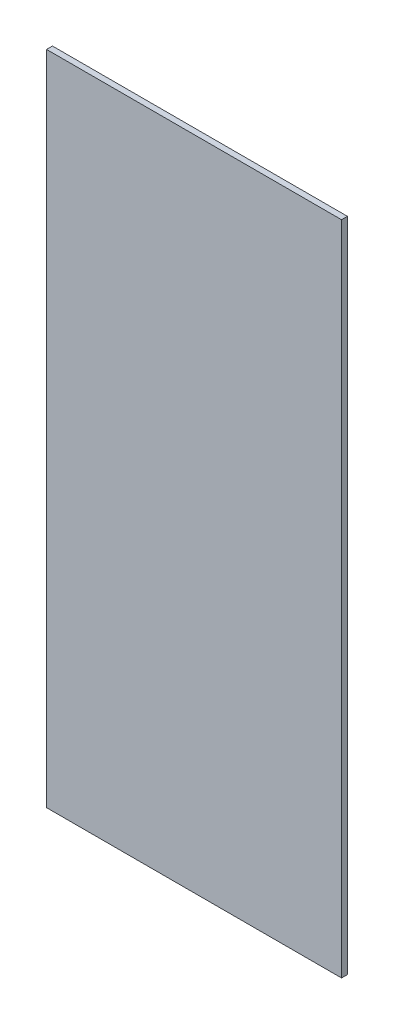
ISO-10303-21;
HEADER;
FILE_DESCRIPTION(('STEP AP214'),'2;1');
FILE_NAME('part.step','',(''),(''),'','','');
FILE_SCHEMA(('AUTOMOTIVE_DESIGN { 1 0 10303 214 1 1 1 1 }'));
ENDSEC;
DATA;
#1=APPLICATION_CONTEXT('core data for automotive mechanical design processes');
#2=APPLICATION_PROTOCOL_DEFINITION('international standard','automotive_design',2000,#1);
#3=PRODUCT_CONTEXT('',#1,'mechanical');
#4=PRODUCT('Part','Part','',(#3));
#5=PRODUCT_RELATED_PRODUCT_CATEGORY('part','',(#4));
#6=PRODUCT_DEFINITION_FORMATION('','',#4);
#7=PRODUCT_DEFINITION_CONTEXT('part definition',#1,'design');
#8=PRODUCT_DEFINITION('design','',#6,#7);
#9=PRODUCT_DEFINITION_SHAPE('','',#8);
#10=(LENGTH_UNIT() NAMED_UNIT(*) SI_UNIT(.MILLI.,.METRE.));
#11=(NAMED_UNIT(*) PLANE_ANGLE_UNIT() SI_UNIT($,.RADIAN.));
#12=(NAMED_UNIT(*) SI_UNIT($,.STERADIAN.) SOLID_ANGLE_UNIT());
#13=UNCERTAINTY_MEASURE_WITH_UNIT(LENGTH_MEASURE(1.E-05),#10,'distance_accuracy_value','');
#14=(GEOMETRIC_REPRESENTATION_CONTEXT(3) GLOBAL_UNCERTAINTY_ASSIGNED_CONTEXT((#13)) GLOBAL_UNIT_ASSIGNED_CONTEXT((#10,
#11,#12)) REPRESENTATION_CONTEXT('',''));
#15=CARTESIAN_POINT('',(0.,0.,0.));
#16=DIRECTION('',(0.,0.,1.));
#17=DIRECTION('',(1.,0.,0.));
#18=AXIS2_PLACEMENT_3D('',#15,#16,#17);
#19=CARTESIAN_POINT('',(0.,0.,20.));
#20=DIRECTION('',(1.,0.,0.));
#21=DIRECTION('',(0.,0.,-1.));
#22=AXIS2_PLACEMENT_3D('',#19,#20,#21);
#23=PLANE('',#22);
#24=DIRECTION('',(0.,-1.,0.));
#25=VECTOR('',#24,1.);
#26=CARTESIAN_POINT('',(0.,0.,0.));
#27=LINE('',#26,#25);
#28=CARTESIAN_POINT('',(0.,2226.,0.));
#29=VERTEX_POINT('',#28);
#30=CARTESIAN_POINT('',(0.,0.,0.));
#31=VERTEX_POINT('',#30);
#32=EDGE_CURVE('E107',#29,#31,#27,.T.);
#33=ORIENTED_EDGE('',*,*,#32,.T.);
#34=DIRECTION('',(0.,0.,-1.));
#35=VECTOR('',#34,1.);
#36=CARTESIAN_POINT('',(0.,0.,20.));
#37=LINE('',#36,#35);
#38=CARTESIAN_POINT('',(0.,0.,20.));
#39=VERTEX_POINT('',#38);
#40=EDGE_CURVE('E11',#39,#31,#37,.T.);
#41=ORIENTED_EDGE('',*,*,#40,.F.);
#42=DIRECTION('',(0.,-1.,0.));
#43=VECTOR('',#42,1.);
#44=CARTESIAN_POINT('',(0.,0.,20.));
#45=LINE('',#44,#43);
#46=CARTESIAN_POINT('',(0.,2226.,20.));
#47=VERTEX_POINT('',#46);
#48=EDGE_CURVE('E91',#47,#39,#45,.T.);
#49=ORIENTED_EDGE('',*,*,#48,.F.);
#50=DIRECTION('',(0.,0.,-1.));
#51=VECTOR('',#50,1.);
#52=CARTESIAN_POINT('',(0.,2226.,20.));
#53=LINE('',#52,#51);
#54=EDGE_CURVE('E103',#47,#29,#53,.T.);
#55=ORIENTED_EDGE('',*,*,#54,.T.);
#56=EDGE_LOOP('',(#33,#41,#49,#55));
#57=FACE_BOUND('',#56,.T.);
#58=ADVANCED_FACE('F39',(#57),#23,.F.);
#59=CARTESIAN_POINT('',(0.,0.,20.));
#60=DIRECTION('',(0.,1.,0.));
#61=DIRECTION('',(0.,0.,1.));
#62=AXIS2_PLACEMENT_3D('',#59,#60,#61);
#63=PLANE('',#62);
#64=DIRECTION('',(1.,0.,0.));
#65=VECTOR('',#64,1.);
#66=CARTESIAN_POINT('',(0.,0.,0.));
#67=LINE('',#66,#65);
#68=CARTESIAN_POINT('',(1000.,0.,0.));
#69=VERTEX_POINT('',#68);
#70=EDGE_CURVE('E96',#31,#69,#67,.T.);
#71=ORIENTED_EDGE('',*,*,#70,.T.);
#72=DIRECTION('',(0.,0.,-1.));
#73=VECTOR('',#72,1.);
#74=CARTESIAN_POINT('',(1000.,0.,20.));
#75=LINE('',#74,#73);
#76=CARTESIAN_POINT('',(1000.,0.,20.));
#77=VERTEX_POINT('',#76);
#78=EDGE_CURVE('E48',#77,#69,#75,.T.);
#79=ORIENTED_EDGE('',*,*,#78,.F.);
#80=DIRECTION('',(1.,0.,0.));
#81=VECTOR('',#80,1.);
#82=CARTESIAN_POINT('',(0.,0.,20.));
#83=LINE('',#82,#81);
#84=EDGE_CURVE('E86',#39,#77,#83,.T.);
#85=ORIENTED_EDGE('',*,*,#84,.F.);
#86=ORIENTED_EDGE('',*,*,#40,.T.);
#87=EDGE_LOOP('',(#71,#79,#85,#86));
#88=FACE_BOUND('',#87,.T.);
#89=ADVANCED_FACE('F95',(#88),#63,.F.);
#90=CARTESIAN_POINT('',(1000.,0.,20.));
#91=DIRECTION('',(-1.,0.,0.));
#92=DIRECTION('',(0.,0.,1.));
#93=AXIS2_PLACEMENT_3D('',#90,#91,#92);
#94=PLANE('',#93);
#95=DIRECTION('',(0.,1.,0.));
#96=VECTOR('',#95,1.);
#97=CARTESIAN_POINT('',(1000.,0.,0.));
#98=LINE('',#97,#96);
#99=CARTESIAN_POINT('',(1000.,2226.,0.));
#100=VERTEX_POINT('',#99);
#101=EDGE_CURVE('E73',#69,#100,#98,.T.);
#102=ORIENTED_EDGE('',*,*,#101,.T.);
#103=DIRECTION('',(0.,0.,-1.));
#104=VECTOR('',#103,1.);
#105=CARTESIAN_POINT('',(1000.,2226.,20.));
#106=LINE('',#105,#104);
#107=CARTESIAN_POINT('',(1000.,2226.,20.));
#108=VERTEX_POINT('',#107);
#109=EDGE_CURVE('E98',#108,#100,#106,.T.);
#110=ORIENTED_EDGE('',*,*,#109,.F.);
#111=DIRECTION('',(0.,1.,0.));
#112=VECTOR('',#111,1.);
#113=CARTESIAN_POINT('',(1000.,0.,20.));
#114=LINE('',#113,#112);
#115=EDGE_CURVE('E89',#77,#108,#114,.T.);
#116=ORIENTED_EDGE('',*,*,#115,.F.);
#117=ORIENTED_EDGE('',*,*,#78,.T.);
#118=EDGE_LOOP('',(#102,#110,#116,#117));
#119=FACE_BOUND('',#118,.T.);
#120=ADVANCED_FACE('F99',(#119),#94,.F.);
#121=CARTESIAN_POINT('',(0.,2226.,20.));
#122=DIRECTION('',(0.,-1.,0.));
#123=DIRECTION('',(0.,0.,-1.));
#124=AXIS2_PLACEMENT_3D('',#121,#122,#123);
#125=PLANE('',#124);
#126=DIRECTION('',(-1.,0.,0.));
#127=VECTOR('',#126,1.);
#128=CARTESIAN_POINT('',(0.,2226.,0.));
#129=LINE('',#128,#127);
#130=EDGE_CURVE('E79',#100,#29,#129,.T.);
#131=ORIENTED_EDGE('',*,*,#130,.T.);
#132=ORIENTED_EDGE('',*,*,#54,.F.);
#133=DIRECTION('',(-1.,0.,0.));
#134=VECTOR('',#133,1.);
#135=CARTESIAN_POINT('',(0.,2226.,20.));
#136=LINE('',#135,#134);
#137=EDGE_CURVE('E56',#108,#47,#136,.T.);
#138=ORIENTED_EDGE('',*,*,#137,.F.);
#139=ORIENTED_EDGE('',*,*,#109,.T.);
#140=EDGE_LOOP('',(#131,#132,#138,#139));
#141=FACE_BOUND('',#140,.T.);
#142=ADVANCED_FACE('F120',(#141),#125,.F.);
#143=CARTESIAN_POINT('',(0.,0.,20.));
#144=DIRECTION('',(0.,0.,-1.));
#145=DIRECTION('',(-1.,0.,0.));
#146=AXIS2_PLACEMENT_3D('',#143,#144,#145);
#147=PLANE('',#146);
#148=ORIENTED_EDGE('',*,*,#48,.T.);
#149=ORIENTED_EDGE('',*,*,#84,.T.);
#150=ORIENTED_EDGE('',*,*,#115,.T.);
#151=ORIENTED_EDGE('',*,*,#137,.T.);
#152=EDGE_LOOP('',(#148,#149,#150,#151));
#153=FACE_BOUND('',#152,.T.);
#154=ADVANCED_FACE('F87',(#153),#147,.F.);
#155=CARTESIAN_POINT('',(0.,0.,0.));
#156=DIRECTION('',(0.,0.,-1.));
#157=DIRECTION('',(-1.,0.,0.));
#158=AXIS2_PLACEMENT_3D('',#155,#156,#157);
#159=PLANE('',#158);
#160=ORIENTED_EDGE('',*,*,#32,.F.);
#161=ORIENTED_EDGE('',*,*,#130,.F.);
#162=ORIENTED_EDGE('',*,*,#101,.F.);
#163=ORIENTED_EDGE('',*,*,#70,.F.);
#164=EDGE_LOOP('',(#160,#161,#162,#163));
#165=FACE_BOUND('',#164,.T.);
#166=ADVANCED_FACE('F123',(#165),#159,.T.);
#167=CLOSED_SHELL('',(#58,#89,#120,#142,#154,#166));
#168=MANIFOLD_SOLID_BREP('B2',#167);
#169=ADVANCED_BREP_SHAPE_REPRESENTATION('',(#18,#168),#14);
#170=SHAPE_DEFINITION_REPRESENTATION(#9,#169);
ENDSEC;
END-ISO-10303-21;
